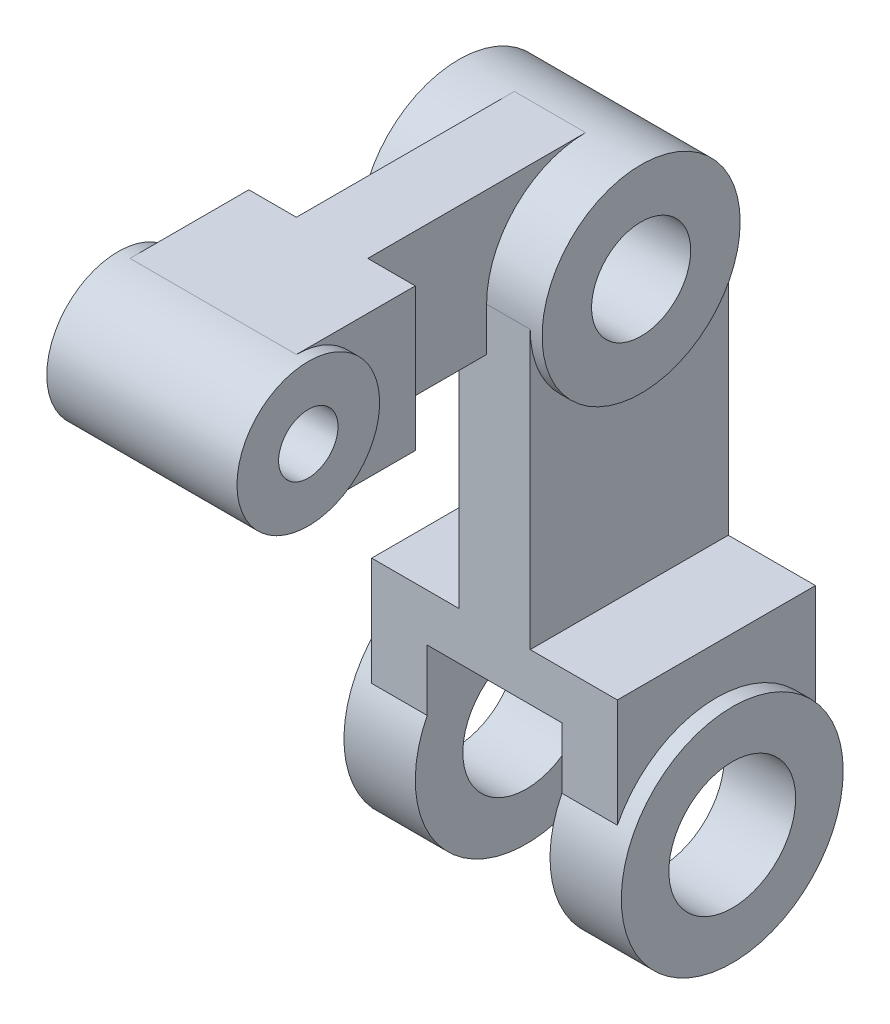
ISO-10303-21;
HEADER;
FILE_DESCRIPTION(('STEP AP214'),'2;1');
FILE_NAME('part.step','',(''),(''),'','','');
FILE_SCHEMA(('AUTOMOTIVE_DESIGN { 1 0 10303 214 1 1 1 1 }'));
ENDSEC;
DATA;
#1=APPLICATION_CONTEXT('core data for automotive mechanical design processes');
#2=APPLICATION_PROTOCOL_DEFINITION('international standard','automotive_design',2000,#1);
#3=PRODUCT_CONTEXT('',#1,'mechanical');
#4=PRODUCT('Part','Part','',(#3));
#5=PRODUCT_RELATED_PRODUCT_CATEGORY('part','',(#4));
#6=PRODUCT_DEFINITION_FORMATION('','',#4);
#7=PRODUCT_DEFINITION_CONTEXT('part definition',#1,'design');
#8=PRODUCT_DEFINITION('design','',#6,#7);
#9=PRODUCT_DEFINITION_SHAPE('','',#8);
#10=(LENGTH_UNIT() NAMED_UNIT(*) SI_UNIT(.MILLI.,.METRE.));
#11=(NAMED_UNIT(*) PLANE_ANGLE_UNIT() SI_UNIT($,.RADIAN.));
#12=(NAMED_UNIT(*) SI_UNIT($,.STERADIAN.) SOLID_ANGLE_UNIT());
#13=UNCERTAINTY_MEASURE_WITH_UNIT(LENGTH_MEASURE(1.E-05),#10,'distance_accuracy_value','');
#14=(GEOMETRIC_REPRESENTATION_CONTEXT(3) GLOBAL_UNCERTAINTY_ASSIGNED_CONTEXT((#13)) GLOBAL_UNIT_ASSIGNED_CONTEXT((#10,
#11,#12)) REPRESENTATION_CONTEXT('',''));
#15=CARTESIAN_POINT('',(0.,0.,0.));
#16=DIRECTION('',(0.,0.,1.));
#17=DIRECTION('',(1.,0.,0.));
#18=AXIS2_PLACEMENT_3D('',#15,#16,#17);
#19=CARTESIAN_POINT('',(31.,40.,25.));
#20=DIRECTION('',(0.,0.,-1.));
#21=DIRECTION('',(0.,1.,0.));
#22=AXIS2_PLACEMENT_3D('',#19,#20,#21);
#23=PLANE('',#22);
#24=DIRECTION('',(1.,0.,0.));
#25=VECTOR('',#24,1.);
#26=CARTESIAN_POINT('',(31.,99.,25.));
#27=LINE('',#26,#25);
#28=CARTESIAN_POINT('',(-9.,99.,25.));
#29=VERTEX_POINT('',#28);
#30=CARTESIAN_POINT('',(-2.,99.,25.));
#31=VERTEX_POINT('',#30);
#32=EDGE_CURVE('E277',#29,#31,#27,.T.);
#33=ORIENTED_EDGE('',*,*,#32,.F.);
#34=DIRECTION('',(0.,1.,0.));
#35=VECTOR('',#34,1.);
#36=CARTESIAN_POINT('',(-9.,0.,25.));
#37=LINE('',#36,#35);
#38=CARTESIAN_POINT('',(-9.,40.,25.));
#39=VERTEX_POINT('',#38);
#40=EDGE_CURVE('E350',#39,#29,#37,.T.);
#41=ORIENTED_EDGE('',*,*,#40,.F.);
#42=DIRECTION('',(-1.,0.,0.));
#43=VECTOR('',#42,1.);
#44=CARTESIAN_POINT('',(31.,40.,25.));
#45=LINE('',#44,#43);
#46=CARTESIAN_POINT('',(-31.,40.,25.));
#47=VERTEX_POINT('',#46);
#48=EDGE_CURVE('E408',#39,#47,#45,.T.);
#49=ORIENTED_EDGE('',*,*,#48,.T.);
#50=DIRECTION('',(0.,-1.,0.));
#51=VECTOR('',#50,1.);
#52=CARTESIAN_POINT('',(-31.,40.,25.));
#53=LINE('',#52,#51);
#54=CARTESIAN_POINT('',(-31.,12.6095202129185,25.));
#55=VERTEX_POINT('',#54);
#56=EDGE_CURVE('E392',#47,#55,#53,.T.);
#57=ORIENTED_EDGE('',*,*,#56,.T.);
#58=DIRECTION('',(-1.,0.,0.));
#59=VECTOR('',#58,1.);
#60=CARTESIAN_POINT('',(31.,12.6095202129185,25.));
#61=LINE('',#60,#59);
#62=CARTESIAN_POINT('',(-17.,12.6095202129185,25.));
#63=VERTEX_POINT('',#62);
#64=EDGE_CURVE('E403',#63,#55,#61,.T.);
#65=ORIENTED_EDGE('',*,*,#64,.F.);
#66=DIRECTION('',(0.,1.,0.));
#67=VECTOR('',#66,1.);
#68=CARTESIAN_POINT('',(-17.,40.,25.));
#69=LINE('',#68,#67);
#70=CARTESIAN_POINT('',(-17.,28.,25.));
#71=VERTEX_POINT('',#70);
#72=EDGE_CURVE('E440',#63,#71,#69,.T.);
#73=ORIENTED_EDGE('',*,*,#72,.T.);
#74=DIRECTION('',(1.,0.,0.));
#75=VECTOR('',#74,1.);
#76=CARTESIAN_POINT('',(31.,28.,25.));
#77=LINE('',#76,#75);
#78=CARTESIAN_POINT('',(17.,28.,25.));
#79=VERTEX_POINT('',#78);
#80=EDGE_CURVE('E436',#71,#79,#77,.T.);
#81=ORIENTED_EDGE('',*,*,#80,.T.);
#82=DIRECTION('',(0.,-1.,0.));
#83=VECTOR('',#82,1.);
#84=CARTESIAN_POINT('',(17.,40.,25.));
#85=LINE('',#84,#83);
#86=CARTESIAN_POINT('',(17.,12.6095202129185,25.));
#87=VERTEX_POINT('',#86);
#88=EDGE_CURVE('E430',#79,#87,#85,.T.);
#89=ORIENTED_EDGE('',*,*,#88,.T.);
#90=CARTESIAN_POINT('',(31.,12.6095202129185,25.));
#91=VERTEX_POINT('',#90);
#92=EDGE_CURVE('E404',#91,#87,#61,.T.);
#93=ORIENTED_EDGE('',*,*,#92,.F.);
#94=DIRECTION('',(0.,-1.,0.));
#95=VECTOR('',#94,1.);
#96=CARTESIAN_POINT('',(31.,40.,25.));
#97=LINE('',#96,#95);
#98=CARTESIAN_POINT('',(31.,40.,25.));
#99=VERTEX_POINT('',#98);
#100=EDGE_CURVE('E376',#99,#91,#97,.T.);
#101=ORIENTED_EDGE('',*,*,#100,.F.);
#102=CARTESIAN_POINT('',(9.,40.,25.));
#103=VERTEX_POINT('',#102);
#104=EDGE_CURVE('E409',#99,#103,#45,.T.);
#105=ORIENTED_EDGE('',*,*,#104,.T.);
#106=DIRECTION('',(0.,1.,0.));
#107=VECTOR('',#106,1.);
#108=CARTESIAN_POINT('',(9.,0.,25.));
#109=LINE('',#108,#107);
#110=CARTESIAN_POINT('',(9.,110.,25.));
#111=VERTEX_POINT('',#110);
#112=EDGE_CURVE('E334',#103,#111,#109,.T.);
#113=ORIENTED_EDGE('',*,*,#112,.T.);
#114=DIRECTION('',(-1.,0.,0.));
#115=VECTOR('',#114,1.);
#116=CARTESIAN_POINT('',(9.,110.,25.));
#117=LINE('',#116,#115);
#118=CARTESIAN_POINT('',(-2.,110.,25.));
#119=VERTEX_POINT('',#118);
#120=EDGE_CURVE('E363',#111,#119,#117,.T.);
#121=ORIENTED_EDGE('',*,*,#120,.T.);
#122=DIRECTION('',(0.,1.,0.));
#123=VECTOR('',#122,1.);
#124=CARTESIAN_POINT('',(-2.,40.,25.));
#125=LINE('',#124,#123);
#126=EDGE_CURVE('E271',#31,#119,#125,.T.);
#127=ORIENTED_EDGE('',*,*,#126,.F.);
#128=EDGE_LOOP('',(#33,#41,#49,#57,#65,#73,#81,#89,#93,#101,#105,#113,#121,#127));
#129=FACE_BOUND('',#128,.T.);
#130=ADVANCED_FACE('F45',(#129),#23,.F.);
#131=CARTESIAN_POINT('',(-9.,0.,0.));
#132=DIRECTION('',(1.,0.,0.));
#133=DIRECTION('',(0.,0.,-1.));
#134=AXIS2_PLACEMENT_3D('',#131,#132,#133);
#135=PLANE('',#134);
#136=DIRECTION('',(0.,0.,1.));
#137=VECTOR('',#136,1.);
#138=CARTESIAN_POINT('',(-9.,99.,0.));
#139=LINE('',#138,#137);
#140=CARTESIAN_POINT('',(-9.,99.,22.4499443206437));
#141=VERTEX_POINT('',#140);
#142=EDGE_CURVE('E274',#141,#29,#139,.T.);
#143=ORIENTED_EDGE('',*,*,#142,.F.);
#144=CARTESIAN_POINT('',(-9.,110.,0.));
#145=DIRECTION('',(1.,0.,0.));
#146=DIRECTION('',(0.,0.,-1.));
#147=AXIS2_PLACEMENT_3D('',#144,#145,#146);
#148=CIRCLE('',#147,25.);
#149=CARTESIAN_POINT('',(-9.,110.,-25.));
#150=VERTEX_POINT('',#149);
#151=EDGE_CURVE('E329',#141,#150,#148,.T.);
#152=ORIENTED_EDGE('',*,*,#151,.T.);
#153=DIRECTION('',(0.,-1.,0.));
#154=VECTOR('',#153,1.);
#155=CARTESIAN_POINT('',(-9.,0.,-25.));
#156=LINE('',#155,#154);
#157=CARTESIAN_POINT('',(-9.,40.,-25.));
#158=VERTEX_POINT('',#157);
#159=EDGE_CURVE('E335',#150,#158,#156,.T.);
#160=ORIENTED_EDGE('',*,*,#159,.T.);
#161=DIRECTION('',(0.,0.,-1.));
#162=VECTOR('',#161,1.);
#163=CARTESIAN_POINT('',(-9.,40.,0.));
#164=LINE('',#163,#162);
#165=EDGE_CURVE('E354',#39,#158,#164,.T.);
#166=ORIENTED_EDGE('',*,*,#165,.F.);
#167=ORIENTED_EDGE('',*,*,#40,.T.);
#168=EDGE_LOOP('',(#143,#152,#160,#166,#167));
#169=FACE_BOUND('',#168,.T.);
#170=ADVANCED_FACE('F464',(#169),#135,.F.);
#171=CARTESIAN_POINT('',(12.,110.,0.));
#172=DIRECTION('',(-1.,0.,0.));
#173=DIRECTION('',(0.,0.,1.));
#174=AXIS2_PLACEMENT_3D('',#171,#172,#173);
#175=CYLINDRICAL_SURFACE('',#174,12.5);
#176=CARTESIAN_POINT('',(12.,110.,0.));
#177=DIRECTION('',(1.,0.,0.));
#178=DIRECTION('',(0.,0.,-1.));
#179=AXIS2_PLACEMENT_3D('',#176,#177,#178);
#180=CIRCLE('',#179,12.5);
#181=CARTESIAN_POINT('',(12.,110.,-12.5));
#182=VERTEX_POINT('',#181);
#183=EDGE_CURVE('E321',#182,#182,#180,.T.);
#184=ORIENTED_EDGE('',*,*,#183,.T.);
#185=EDGE_LOOP('',(#184));
#186=FACE_BOUND('',#185,.T.);
#187=CARTESIAN_POINT('',(-34.,110.,0.));
#188=DIRECTION('',(1.,0.,0.));
#189=DIRECTION('',(0.,0.,-1.));
#190=AXIS2_PLACEMENT_3D('',#187,#188,#189);
#191=CIRCLE('',#190,12.5);
#192=CARTESIAN_POINT('',(-34.,110.,-12.5));
#193=VERTEX_POINT('',#192);
#194=EDGE_CURVE('E313',#193,#193,#191,.T.);
#195=ORIENTED_EDGE('',*,*,#194,.F.);
#196=EDGE_LOOP('',(#195));
#197=FACE_BOUND('',#196,.T.);
#198=ADVANCED_FACE('F522',(#186,#197),#175,.F.);
#199=CARTESIAN_POINT('',(12.,110.,0.));
#200=DIRECTION('',(-1.,0.,0.));
#201=DIRECTION('',(0.,0.,1.));
#202=AXIS2_PLACEMENT_3D('',#199,#200,#201);
#203=CYLINDRICAL_SURFACE('',#202,25.);
#204=CARTESIAN_POINT('',(-34.,110.,0.));
#205=DIRECTION('',(1.,0.,0.));
#206=DIRECTION('',(0.,0.,-1.));
#207=AXIS2_PLACEMENT_3D('',#204,#205,#206);
#208=CIRCLE('',#207,25.);
#209=CARTESIAN_POINT('',(-34.,110.,-25.));
#210=VERTEX_POINT('',#209);
#211=EDGE_CURVE('E317',#210,#210,#208,.T.);
#212=ORIENTED_EDGE('',*,*,#211,.T.);
#213=EDGE_LOOP('',(#212));
#214=FACE_BOUND('',#213,.T.);
#215=CARTESIAN_POINT('',(12.,110.,0.));
#216=DIRECTION('',(1.,0.,0.));
#217=DIRECTION('',(0.,0.,-1.));
#218=AXIS2_PLACEMENT_3D('',#215,#216,#217);
#219=CIRCLE('',#218,25.);
#220=CARTESIAN_POINT('',(12.,110.,-25.));
#221=VERTEX_POINT('',#220);
#222=EDGE_CURVE('E325',#221,#221,#219,.T.);
#223=ORIENTED_EDGE('',*,*,#222,.F.);
#224=EDGE_LOOP('',(#223));
#225=FACE_BOUND('',#224,.T.);
#226=DIRECTION('',(-1.,0.,0.));
#227=VECTOR('',#226,1.);
#228=CARTESIAN_POINT('',(12.,99.,22.4499443206437));
#229=LINE('',#228,#227);
#230=CARTESIAN_POINT('',(-20.,99.,22.4499443206437));
#231=VERTEX_POINT('',#230);
#232=EDGE_CURVE('E11',#231,#141,#229,.F.);
#233=ORIENTED_EDGE('',*,*,#232,.F.);
#234=CARTESIAN_POINT('',(-20.,110.,0.));
#235=DIRECTION('',(1.,0.,0.));
#236=DIRECTION('',(0.,0.,-1.));
#237=AXIS2_PLACEMENT_3D('',#234,#235,#236);
#238=CIRCLE('',#237,25.);
#239=CARTESIAN_POINT('',(-20.,135.,0.));
#240=VERTEX_POINT('',#239);
#241=EDGE_CURVE('E55',#240,#231,#238,.T.);
#242=ORIENTED_EDGE('',*,*,#241,.F.);
#243=DIRECTION('',(-1.,0.,0.));
#244=VECTOR('',#243,1.);
#245=CARTESIAN_POINT('',(-20.,135.,0.));
#246=LINE('',#245,#244);
#247=CARTESIAN_POINT('',(-2.,135.,0.));
#248=VERTEX_POINT('',#247);
#249=EDGE_CURVE('E246',#248,#240,#246,.T.);
#250=ORIENTED_EDGE('',*,*,#249,.F.);
#251=CARTESIAN_POINT('',(-2.,110.,0.));
#252=DIRECTION('',(-1.,0.,0.));
#253=DIRECTION('',(0.,0.,1.));
#254=AXIS2_PLACEMENT_3D('',#251,#252,#253);
#255=CIRCLE('',#254,25.);
#256=EDGE_CURVE('E444',#119,#248,#255,.T.);
#257=ORIENTED_EDGE('',*,*,#256,.F.);
#258=ORIENTED_EDGE('',*,*,#120,.F.);
#259=CARTESIAN_POINT('',(9.,110.,0.));
#260=DIRECTION('',(1.,0.,0.));
#261=DIRECTION('',(0.,0.,-1.));
#262=AXIS2_PLACEMENT_3D('',#259,#260,#261);
#263=CIRCLE('',#262,25.);
#264=CARTESIAN_POINT('',(9.,110.,-25.));
#265=VERTEX_POINT('',#264);
#266=EDGE_CURVE('E330',#111,#265,#263,.T.);
#267=ORIENTED_EDGE('',*,*,#266,.T.);
#268=DIRECTION('',(-1.,0.,0.));
#269=VECTOR('',#268,1.);
#270=CARTESIAN_POINT('',(9.,110.,-25.));
#271=LINE('',#270,#269);
#272=EDGE_CURVE('E347',#265,#150,#271,.T.);
#273=ORIENTED_EDGE('',*,*,#272,.T.);
#274=ORIENTED_EDGE('',*,*,#151,.F.);
#275=EDGE_LOOP('',(#233,#242,#250,#257,#258,#267,#273,#274));
#276=FACE_BOUND('',#275,.T.);
#277=ADVANCED_FACE('F460',(#214,#225,#276),#203,.T.);
#278=CARTESIAN_POINT('',(35.,0.,0.));
#279=DIRECTION('',(-1.,0.,0.));
#280=DIRECTION('',(0.,0.,1.));
#281=AXIS2_PLACEMENT_3D('',#278,#279,#280);
#282=CYLINDRICAL_SURFACE('',#281,28.);
#283=CARTESIAN_POINT('',(35.,0.,0.));
#284=DIRECTION('',(1.,0.,0.));
#285=DIRECTION('',(0.,0.,-1.));
#286=AXIS2_PLACEMENT_3D('',#283,#284,#285);
#287=CIRCLE('',#286,28.);
#288=CARTESIAN_POINT('',(35.,0.,-28.));
#289=VERTEX_POINT('',#288);
#290=EDGE_CURVE('E426',#289,#289,#287,.T.);
#291=ORIENTED_EDGE('',*,*,#290,.F.);
#292=EDGE_LOOP('',(#291));
#293=FACE_BOUND('',#292,.T.);
#294=ORIENTED_EDGE('',*,*,#92,.T.);
#295=CARTESIAN_POINT('',(17.,0.,0.));
#296=DIRECTION('',(1.,0.,0.));
#297=DIRECTION('',(0.,1.,0.));
#298=AXIS2_PLACEMENT_3D('',#295,#296,#297);
#299=CIRCLE('',#298,28.);
#300=CARTESIAN_POINT('',(17.,12.6095202129185,-25.));
#301=VERTEX_POINT('',#300);
#302=EDGE_CURVE('E70',#87,#301,#299,.T.);
#303=ORIENTED_EDGE('',*,*,#302,.T.);
#304=DIRECTION('',(-1.,0.,0.));
#305=VECTOR('',#304,1.);
#306=CARTESIAN_POINT('',(31.,12.6095202129185,-25.));
#307=LINE('',#306,#305);
#308=CARTESIAN_POINT('',(31.,12.6095202129185,-25.));
#309=VERTEX_POINT('',#308);
#310=EDGE_CURVE('E399',#309,#301,#307,.T.);
#311=ORIENTED_EDGE('',*,*,#310,.F.);
#312=CARTESIAN_POINT('',(31.,0.,0.));
#313=DIRECTION('',(-1.,0.,0.));
#314=DIRECTION('',(0.,0.,-1.));
#315=AXIS2_PLACEMENT_3D('',#312,#313,#314);
#316=CIRCLE('',#315,28.);
#317=EDGE_CURVE('E380',#91,#309,#316,.T.);
#318=ORIENTED_EDGE('',*,*,#317,.F.);
#319=EDGE_LOOP('',(#294,#303,#311,#318));
#320=FACE_BOUND('',#319,.T.);
#321=ADVANCED_FACE('F553',(#293,#320),#282,.T.);
#322=CARTESIAN_POINT('',(35.,0.,0.));
#323=DIRECTION('',(-1.,0.,0.));
#324=DIRECTION('',(0.,0.,1.));
#325=AXIS2_PLACEMENT_3D('',#322,#323,#324);
#326=CYLINDRICAL_SURFACE('',#325,16.);
#327=CARTESIAN_POINT('',(-17.,0.,0.));
#328=DIRECTION('',(-1.,0.,0.));
#329=DIRECTION('',(0.,-1.,0.));
#330=AXIS2_PLACEMENT_3D('',#327,#328,#329);
#331=CIRCLE('',#330,16.);
#332=CARTESIAN_POINT('',(-17.,-16.,0.));
#333=VERTEX_POINT('',#332);
#334=EDGE_CURVE('E309',#333,#333,#331,.T.);
#335=ORIENTED_EDGE('',*,*,#334,.F.);
#336=EDGE_LOOP('',(#335));
#337=FACE_BOUND('',#336,.T.);
#338=CARTESIAN_POINT('',(-35.,0.,0.));
#339=DIRECTION('',(1.,0.,0.));
#340=DIRECTION('',(0.,0.,-1.));
#341=AXIS2_PLACEMENT_3D('',#338,#339,#340);
#342=CIRCLE('',#341,16.);
#343=CARTESIAN_POINT('',(-35.,0.,-16.));
#344=VERTEX_POINT('',#343);
#345=EDGE_CURVE('E417',#344,#344,#342,.T.);
#346=ORIENTED_EDGE('',*,*,#345,.F.);
#347=EDGE_LOOP('',(#346));
#348=FACE_BOUND('',#347,.T.);
#349=ADVANCED_FACE('F542',(#337,#348),#326,.F.);
#350=CARTESIAN_POINT('',(31.,40.,25.));
#351=DIRECTION('',(0.,-1.,0.));
#352=DIRECTION('',(0.,0.,-1.));
#353=AXIS2_PLACEMENT_3D('',#350,#351,#352);
#354=PLANE('',#353);
#355=DIRECTION('',(0.,0.,-1.));
#356=VECTOR('',#355,1.);
#357=CARTESIAN_POINT('',(9.,40.,0.));
#358=LINE('',#357,#356);
#359=CARTESIAN_POINT('',(9.,40.,-25.));
#360=VERTEX_POINT('',#359);
#361=EDGE_CURVE('E339',#103,#360,#358,.T.);
#362=ORIENTED_EDGE('',*,*,#361,.F.);
#363=ORIENTED_EDGE('',*,*,#104,.F.);
#364=DIRECTION('',(0.,0.,1.));
#365=VECTOR('',#364,1.);
#366=CARTESIAN_POINT('',(31.,40.,25.));
#367=LINE('',#366,#365);
#368=CARTESIAN_POINT('',(31.,40.,-25.));
#369=VERTEX_POINT('',#368);
#370=EDGE_CURVE('E372',#369,#99,#367,.T.);
#371=ORIENTED_EDGE('',*,*,#370,.F.);
#372=DIRECTION('',(-1.,0.,0.));
#373=VECTOR('',#372,1.);
#374=CARTESIAN_POINT('',(31.,40.,-25.));
#375=LINE('',#374,#373);
#376=EDGE_CURVE('E414',#369,#360,#375,.T.);
#377=ORIENTED_EDGE('',*,*,#376,.T.);
#378=EDGE_LOOP('',(#362,#363,#371,#377));
#379=FACE_BOUND('',#378,.T.);
#380=ADVANCED_FACE('F534',(#379),#354,.F.);
#381=CARTESIAN_POINT('',(35.,0.,0.));
#382=DIRECTION('',(1.,0.,0.));
#383=DIRECTION('',(0.,0.,-1.));
#384=AXIS2_PLACEMENT_3D('',#381,#382,#383);
#385=PLANE('',#384);
#386=ORIENTED_EDGE('',*,*,#290,.T.);
#387=EDGE_LOOP('',(#386));
#388=FACE_BOUND('',#387,.T.);
#389=CARTESIAN_POINT('',(35.,0.,0.));
#390=DIRECTION('',(1.,0.,0.));
#391=DIRECTION('',(0.,0.,-1.));
#392=AXIS2_PLACEMENT_3D('',#389,#390,#391);
#393=CIRCLE('',#392,16.);
#394=CARTESIAN_POINT('',(35.,0.,-16.));
#395=VERTEX_POINT('',#394);
#396=EDGE_CURVE('E418',#395,#395,#393,.T.);
#397=ORIENTED_EDGE('',*,*,#396,.F.);
#398=EDGE_LOOP('',(#397));
#399=FACE_BOUND('',#398,.T.);
#400=ADVANCED_FACE('F543',(#388,#399),#385,.T.);
#401=CARTESIAN_POINT('',(-35.,0.,0.));
#402=DIRECTION('',(1.,0.,0.));
#403=DIRECTION('',(0.,0.,-1.));
#404=AXIS2_PLACEMENT_3D('',#401,#402,#403);
#405=PLANE('',#404);
#406=CARTESIAN_POINT('',(-35.,0.,0.));
#407=DIRECTION('',(1.,0.,0.));
#408=DIRECTION('',(0.,0.,-1.));
#409=AXIS2_PLACEMENT_3D('',#406,#407,#408);
#410=CIRCLE('',#409,28.);
#411=CARTESIAN_POINT('',(-35.,0.,-28.));
#412=VERTEX_POINT('',#411);
#413=EDGE_CURVE('E422',#412,#412,#410,.T.);
#414=ORIENTED_EDGE('',*,*,#413,.F.);
#415=EDGE_LOOP('',(#414));
#416=FACE_BOUND('',#415,.T.);
#417=ORIENTED_EDGE('',*,*,#345,.T.);
#418=EDGE_LOOP('',(#417));
#419=FACE_BOUND('',#418,.T.);
#420=ADVANCED_FACE('F545',(#416,#419),#405,.F.);
#421=CARTESIAN_POINT('',(-17.,0.,0.));
#422=DIRECTION('',(-1.,0.,0.));
#423=DIRECTION('',(0.,-1.,0.));
#424=AXIS2_PLACEMENT_3D('',#421,#422,#423);
#425=CIRCLE('',#424,28.);
#426=CARTESIAN_POINT('',(-17.,12.6095202129185,-25.));
#427=VERTEX_POINT('',#426);
#428=EDGE_CURVE('E302',#427,#63,#425,.T.);
#429=ORIENTED_EDGE('',*,*,#428,.T.);
#430=ORIENTED_EDGE('',*,*,#64,.T.);
#431=CARTESIAN_POINT('',(-31.,0.,0.));
#432=DIRECTION('',(-1.,0.,0.));
#433=DIRECTION('',(0.,0.,-1.));
#434=AXIS2_PLACEMENT_3D('',#431,#432,#433);
#435=CIRCLE('',#434,28.);
#436=CARTESIAN_POINT('',(-31.,12.6095202129185,-25.));
#437=VERTEX_POINT('',#436);
#438=EDGE_CURVE('E373',#55,#437,#435,.T.);
#439=ORIENTED_EDGE('',*,*,#438,.T.);
#440=EDGE_CURVE('E384',#427,#437,#307,.T.);
#441=ORIENTED_EDGE('',*,*,#440,.F.);
#442=EDGE_LOOP('',(#429,#430,#439,#441));
#443=FACE_BOUND('',#442,.T.);
#444=ORIENTED_EDGE('',*,*,#413,.T.);
#445=EDGE_LOOP('',(#444));
#446=FACE_BOUND('',#445,.T.);
#447=ADVANCED_FACE('F47',(#443,#446),#282,.T.);
#448=CARTESIAN_POINT('',(17.,0.,0.));
#449=DIRECTION('',(1.,0.,0.));
#450=DIRECTION('',(0.,1.,0.));
#451=AXIS2_PLACEMENT_3D('',#448,#449,#450);
#452=CIRCLE('',#451,16.);
#453=CARTESIAN_POINT('',(17.,16.,0.));
#454=VERTEX_POINT('',#453);
#455=EDGE_CURVE('E294',#454,#454,#452,.T.);
#456=ORIENTED_EDGE('',*,*,#455,.F.);
#457=EDGE_LOOP('',(#456));
#458=FACE_BOUND('',#457,.T.);
#459=ORIENTED_EDGE('',*,*,#396,.T.);
#460=EDGE_LOOP('',(#459));
#461=FACE_BOUND('',#460,.T.);
#462=ADVANCED_FACE('F537',(#458,#461),#326,.F.);
#463=CARTESIAN_POINT('',(31.,40.,-25.));
#464=DIRECTION('',(0.,0.,1.));
#465=DIRECTION('',(0.,-1.,0.));
#466=AXIS2_PLACEMENT_3D('',#463,#464,#465);
#467=PLANE('',#466);
#468=DIRECTION('',(-1.,0.,0.));
#469=VECTOR('',#468,1.);
#470=CARTESIAN_POINT('',(31.,28.,-25.));
#471=LINE('',#470,#469);
#472=CARTESIAN_POINT('',(17.,28.,-25.));
#473=VERTEX_POINT('',#472);
#474=CARTESIAN_POINT('',(-17.,28.,-25.));
#475=VERTEX_POINT('',#474);
#476=EDGE_CURVE('E298',#473,#475,#471,.T.);
#477=ORIENTED_EDGE('',*,*,#476,.T.);
#478=DIRECTION('',(0.,-1.,0.));
#479=VECTOR('',#478,1.);
#480=CARTESIAN_POINT('',(-17.,40.,-25.));
#481=LINE('',#480,#479);
#482=EDGE_CURVE('E305',#475,#427,#481,.T.);
#483=ORIENTED_EDGE('',*,*,#482,.T.);
#484=ORIENTED_EDGE('',*,*,#440,.T.);
#485=DIRECTION('',(0.,1.,0.));
#486=VECTOR('',#485,1.);
#487=CARTESIAN_POINT('',(-31.,40.,-25.));
#488=LINE('',#487,#486);
#489=CARTESIAN_POINT('',(-31.,40.,-25.));
#490=VERTEX_POINT('',#489);
#491=EDGE_CURVE('E367',#437,#490,#488,.T.);
#492=ORIENTED_EDGE('',*,*,#491,.T.);
#493=EDGE_CURVE('E413',#158,#490,#375,.T.);
#494=ORIENTED_EDGE('',*,*,#493,.F.);
#495=ORIENTED_EDGE('',*,*,#159,.F.);
#496=ORIENTED_EDGE('',*,*,#272,.F.);
#497=DIRECTION('',(0.,-1.,0.));
#498=VECTOR('',#497,1.);
#499=CARTESIAN_POINT('',(9.,0.,-25.));
#500=LINE('',#499,#498);
#501=EDGE_CURVE('E343',#265,#360,#500,.T.);
#502=ORIENTED_EDGE('',*,*,#501,.T.);
#503=ORIENTED_EDGE('',*,*,#376,.F.);
#504=DIRECTION('',(0.,1.,0.));
#505=VECTOR('',#504,1.);
#506=CARTESIAN_POINT('',(31.,40.,-25.));
#507=LINE('',#506,#505);
#508=EDGE_CURVE('E368',#309,#369,#507,.T.);
#509=ORIENTED_EDGE('',*,*,#508,.F.);
#510=ORIENTED_EDGE('',*,*,#310,.T.);
#511=DIRECTION('',(0.,1.,0.));
#512=VECTOR('',#511,1.);
#513=CARTESIAN_POINT('',(17.,40.,-25.));
#514=LINE('',#513,#512);
#515=EDGE_CURVE('E290',#301,#473,#514,.T.);
#516=ORIENTED_EDGE('',*,*,#515,.T.);
#517=EDGE_LOOP('',(#477,#483,#484,#492,#494,#495,#496,#502,#503,#509,#510,#516));
#518=FACE_BOUND('',#517,.T.);
#519=ADVANCED_FACE('F532',(#518),#467,.F.);
#520=ORIENTED_EDGE('',*,*,#48,.F.);
#521=ORIENTED_EDGE('',*,*,#165,.T.);
#522=ORIENTED_EDGE('',*,*,#493,.T.);
#523=DIRECTION('',(0.,0.,1.));
#524=VECTOR('',#523,1.);
#525=CARTESIAN_POINT('',(-31.,40.,25.));
#526=LINE('',#525,#524);
#527=EDGE_CURVE('E388',#490,#47,#526,.T.);
#528=ORIENTED_EDGE('',*,*,#527,.T.);
#529=EDGE_LOOP('',(#520,#521,#522,#528));
#530=FACE_BOUND('',#529,.T.);
#531=ADVANCED_FACE('F528',(#530),#354,.F.);
#532=CARTESIAN_POINT('',(31.,0.,0.));
#533=DIRECTION('',(1.,0.,0.));
#534=DIRECTION('',(0.,0.,-1.));
#535=AXIS2_PLACEMENT_3D('',#532,#533,#534);
#536=PLANE('',#535);
#537=ORIENTED_EDGE('',*,*,#508,.T.);
#538=ORIENTED_EDGE('',*,*,#370,.T.);
#539=ORIENTED_EDGE('',*,*,#100,.T.);
#540=ORIENTED_EDGE('',*,*,#317,.T.);
#541=EDGE_LOOP('',(#537,#538,#539,#540));
#542=FACE_BOUND('',#541,.T.);
#543=ADVANCED_FACE('F531',(#542),#536,.T.);
#544=CARTESIAN_POINT('',(-31.,0.,0.));
#545=DIRECTION('',(1.,0.,0.));
#546=DIRECTION('',(0.,0.,-1.));
#547=AXIS2_PLACEMENT_3D('',#544,#545,#546);
#548=PLANE('',#547);
#549=ORIENTED_EDGE('',*,*,#491,.F.);
#550=ORIENTED_EDGE('',*,*,#438,.F.);
#551=ORIENTED_EDGE('',*,*,#56,.F.);
#552=ORIENTED_EDGE('',*,*,#527,.F.);
#553=EDGE_LOOP('',(#549,#550,#551,#552));
#554=FACE_BOUND('',#553,.T.);
#555=ADVANCED_FACE('F526',(#554),#548,.F.);
#556=CARTESIAN_POINT('',(9.,0.,0.));
#557=DIRECTION('',(1.,0.,0.));
#558=DIRECTION('',(0.,0.,-1.));
#559=AXIS2_PLACEMENT_3D('',#556,#557,#558);
#560=PLANE('',#559);
#561=ORIENTED_EDGE('',*,*,#266,.F.);
#562=ORIENTED_EDGE('',*,*,#112,.F.);
#563=ORIENTED_EDGE('',*,*,#361,.T.);
#564=ORIENTED_EDGE('',*,*,#501,.F.);
#565=EDGE_LOOP('',(#561,#562,#563,#564));
#566=FACE_BOUND('',#565,.T.);
#567=ADVANCED_FACE('F593',(#566),#560,.T.);
#568=CARTESIAN_POINT('',(12.,0.,0.));
#569=DIRECTION('',(1.,0.,0.));
#570=DIRECTION('',(0.,0.,-1.));
#571=AXIS2_PLACEMENT_3D('',#568,#569,#570);
#572=PLANE('',#571);
#573=ORIENTED_EDGE('',*,*,#183,.F.);
#574=EDGE_LOOP('',(#573));
#575=FACE_BOUND('',#574,.T.);
#576=ORIENTED_EDGE('',*,*,#222,.T.);
#577=EDGE_LOOP('',(#576));
#578=FACE_BOUND('',#577,.T.);
#579=ADVANCED_FACE('F614',(#575,#578),#572,.T.);
#580=CARTESIAN_POINT('',(-34.,0.,0.));
#581=DIRECTION('',(1.,0.,0.));
#582=DIRECTION('',(0.,0.,-1.));
#583=AXIS2_PLACEMENT_3D('',#580,#581,#582);
#584=PLANE('',#583);
#585=ORIENTED_EDGE('',*,*,#194,.T.);
#586=EDGE_LOOP('',(#585));
#587=FACE_BOUND('',#586,.T.);
#588=ORIENTED_EDGE('',*,*,#211,.F.);
#589=EDGE_LOOP('',(#588));
#590=FACE_BOUND('',#589,.T.);
#591=ADVANCED_FACE('F572',(#587,#590),#584,.F.);
#592=CARTESIAN_POINT('',(-17.,28.,-28.));
#593=DIRECTION('',(-1.,0.,0.));
#594=DIRECTION('',(0.,-1.,0.));
#595=AXIS2_PLACEMENT_3D('',#592,#593,#594);
#596=PLANE('',#595);
#597=ORIENTED_EDGE('',*,*,#334,.T.);
#598=EDGE_LOOP('',(#597));
#599=FACE_BOUND('',#598,.T.);
#600=DIRECTION('',(0.,0.,1.));
#601=VECTOR('',#600,1.);
#602=CARTESIAN_POINT('',(-17.,28.,-28.));
#603=LINE('',#602,#601);
#604=EDGE_CURVE('E281',#475,#71,#603,.T.);
#605=ORIENTED_EDGE('',*,*,#604,.T.);
#606=ORIENTED_EDGE('',*,*,#72,.F.);
#607=ORIENTED_EDGE('',*,*,#428,.F.);
#608=ORIENTED_EDGE('',*,*,#482,.F.);
#609=EDGE_LOOP('',(#605,#606,#607,#608));
#610=FACE_BOUND('',#609,.T.);
#611=ADVANCED_FACE('F568',(#599,#610),#596,.F.);
#612=CARTESIAN_POINT('',(-17.,28.,-28.));
#613=DIRECTION('',(0.,1.,0.));
#614=DIRECTION('',(0.,0.,1.));
#615=AXIS2_PLACEMENT_3D('',#612,#613,#614);
#616=PLANE('',#615);
#617=DIRECTION('',(0.,0.,1.));
#618=VECTOR('',#617,1.);
#619=CARTESIAN_POINT('',(17.,28.,-28.));
#620=LINE('',#619,#618);
#621=EDGE_CURVE('E280',#473,#79,#620,.T.);
#622=ORIENTED_EDGE('',*,*,#621,.T.);
#623=ORIENTED_EDGE('',*,*,#80,.F.);
#624=ORIENTED_EDGE('',*,*,#604,.F.);
#625=ORIENTED_EDGE('',*,*,#476,.F.);
#626=EDGE_LOOP('',(#622,#623,#624,#625));
#627=FACE_BOUND('',#626,.T.);
#628=ADVANCED_FACE('F571',(#627),#616,.F.);
#629=CARTESIAN_POINT('',(17.,28.,-28.));
#630=DIRECTION('',(1.,0.,0.));
#631=DIRECTION('',(0.,1.,0.));
#632=AXIS2_PLACEMENT_3D('',#629,#630,#631);
#633=PLANE('',#632);
#634=ORIENTED_EDGE('',*,*,#455,.T.);
#635=EDGE_LOOP('',(#634));
#636=FACE_BOUND('',#635,.T.);
#637=ORIENTED_EDGE('',*,*,#302,.F.);
#638=ORIENTED_EDGE('',*,*,#88,.F.);
#639=ORIENTED_EDGE('',*,*,#621,.F.);
#640=ORIENTED_EDGE('',*,*,#515,.F.);
#641=EDGE_LOOP('',(#637,#638,#639,#640));
#642=FACE_BOUND('',#641,.T.);
#643=ADVANCED_FACE('F601',(#636,#642),#633,.F.);
#644=CARTESIAN_POINT('',(-20.,135.,55.));
#645=DIRECTION('',(0.,-1.,0.));
#646=DIRECTION('',(0.,0.,-1.));
#647=AXIS2_PLACEMENT_3D('',#644,#645,#646);
#648=PLANE('',#647);
#649=ORIENTED_EDGE('',*,*,#249,.T.);
#650=DIRECTION('',(0.,0.,-1.));
#651=VECTOR('',#650,1.);
#652=CARTESIAN_POINT('',(-20.,135.,55.));
#653=LINE('',#652,#651);
#654=CARTESIAN_POINT('',(-20.,135.,55.));
#655=VERTEX_POINT('',#654);
#656=EDGE_CURVE('E255',#655,#240,#653,.T.);
#657=ORIENTED_EDGE('',*,*,#656,.F.);
#658=DIRECTION('',(-1.,0.,0.));
#659=VECTOR('',#658,1.);
#660=CARTESIAN_POINT('',(-32.,135.,55.));
#661=LINE('',#660,#659);
#662=CARTESIAN_POINT('',(-32.,135.,55.));
#663=VERTEX_POINT('',#662);
#664=EDGE_CURVE('E195',#655,#663,#661,.T.);
#665=ORIENTED_EDGE('',*,*,#664,.T.);
#666=DIRECTION('',(0.,0.,-1.));
#667=VECTOR('',#666,1.);
#668=CARTESIAN_POINT('',(-32.,135.,85.));
#669=LINE('',#668,#667);
#670=CARTESIAN_POINT('',(-32.,135.,85.));
#671=VERTEX_POINT('',#670);
#672=EDGE_CURVE('E187',#671,#663,#669,.T.);
#673=ORIENTED_EDGE('',*,*,#672,.F.);
#674=DIRECTION('',(-1.,0.,0.));
#675=VECTOR('',#674,1.);
#676=CARTESIAN_POINT('',(-32.,135.,85.));
#677=LINE('',#676,#675);
#678=CARTESIAN_POINT('',(10.,135.,85.));
#679=VERTEX_POINT('',#678);
#680=EDGE_CURVE('E192',#679,#671,#677,.T.);
#681=ORIENTED_EDGE('',*,*,#680,.F.);
#682=DIRECTION('',(0.,0.,-1.));
#683=VECTOR('',#682,1.);
#684=CARTESIAN_POINT('',(10.,135.,85.));
#685=LINE('',#684,#683);
#686=CARTESIAN_POINT('',(10.,135.,55.));
#687=VERTEX_POINT('',#686);
#688=EDGE_CURVE('E199',#679,#687,#685,.T.);
#689=ORIENTED_EDGE('',*,*,#688,.T.);
#690=CARTESIAN_POINT('',(-2.00000000000001,135.,55.));
#691=VERTEX_POINT('',#690);
#692=EDGE_CURVE('E233',#687,#691,#661,.T.);
#693=ORIENTED_EDGE('',*,*,#692,.T.);
#694=DIRECTION('',(0.,0.,-1.));
#695=VECTOR('',#694,1.);
#696=CARTESIAN_POINT('',(-2.,135.,55.));
#697=LINE('',#696,#695);
#698=EDGE_CURVE('E62',#691,#248,#697,.T.);
#699=ORIENTED_EDGE('',*,*,#698,.T.);
#700=EDGE_LOOP('',(#649,#657,#665,#673,#681,#689,#693,#699));
#701=FACE_BOUND('',#700,.T.);
#702=ADVANCED_FACE('F189',(#701),#648,.F.);
#703=CARTESIAN_POINT('',(-2.,99.,55.));
#704=DIRECTION('',(-1.,0.,0.));
#705=DIRECTION('',(0.,0.,1.));
#706=AXIS2_PLACEMENT_3D('',#703,#704,#705);
#707=PLANE('',#706);
#708=DIRECTION('',(0.,0.,-1.));
#709=VECTOR('',#708,1.);
#710=CARTESIAN_POINT('',(-2.,99.,55.));
#711=LINE('',#710,#709);
#712=CARTESIAN_POINT('',(-2.,99.,55.));
#713=VERTEX_POINT('',#712);
#714=EDGE_CURVE('E263',#713,#31,#711,.T.);
#715=ORIENTED_EDGE('',*,*,#714,.T.);
#716=ORIENTED_EDGE('',*,*,#126,.T.);
#717=ORIENTED_EDGE('',*,*,#256,.T.);
#718=ORIENTED_EDGE('',*,*,#698,.F.);
#719=DIRECTION('',(0.,1.,0.));
#720=VECTOR('',#719,1.);
#721=CARTESIAN_POINT('',(-2.,99.,55.));
#722=LINE('',#721,#720);
#723=EDGE_CURVE('E251',#713,#691,#722,.T.);
#724=ORIENTED_EDGE('',*,*,#723,.F.);
#725=EDGE_LOOP('',(#715,#716,#717,#718,#724));
#726=FACE_BOUND('',#725,.T.);
#727=ADVANCED_FACE('F473',(#726),#707,.F.);
#728=CARTESIAN_POINT('',(-20.,99.,55.));
#729=DIRECTION('',(1.,0.,0.));
#730=DIRECTION('',(0.,0.,-1.));
#731=AXIS2_PLACEMENT_3D('',#728,#729,#730);
#732=PLANE('',#731);
#733=ORIENTED_EDGE('',*,*,#656,.T.);
#734=ORIENTED_EDGE('',*,*,#241,.T.);
#735=DIRECTION('',(0.,0.,-1.));
#736=VECTOR('',#735,1.);
#737=CARTESIAN_POINT('',(-20.,99.,55.));
#738=LINE('',#737,#736);
#739=CARTESIAN_POINT('',(-20.,99.,55.));
#740=VERTEX_POINT('',#739);
#741=EDGE_CURVE('E267',#740,#231,#738,.T.);
#742=ORIENTED_EDGE('',*,*,#741,.F.);
#743=DIRECTION('',(0.,-1.,0.));
#744=VECTOR('',#743,1.);
#745=CARTESIAN_POINT('',(-20.,99.,55.));
#746=LINE('',#745,#744);
#747=EDGE_CURVE('E247',#655,#740,#746,.T.);
#748=ORIENTED_EDGE('',*,*,#747,.F.);
#749=EDGE_LOOP('',(#733,#734,#742,#748));
#750=FACE_BOUND('',#749,.T.);
#751=ADVANCED_FACE('F450',(#750),#732,.F.);
#752=CARTESIAN_POINT('',(-20.,99.,55.));
#753=DIRECTION('',(0.,1.,0.));
#754=DIRECTION('',(0.,0.,1.));
#755=AXIS2_PLACEMENT_3D('',#752,#753,#754);
#756=PLANE('',#755);
#757=ORIENTED_EDGE('',*,*,#142,.T.);
#758=ORIENTED_EDGE('',*,*,#32,.T.);
#759=ORIENTED_EDGE('',*,*,#714,.F.);
#760=DIRECTION('',(1.,0.,0.));
#761=VECTOR('',#760,1.);
#762=CARTESIAN_POINT('',(-32.,99.,55.));
#763=LINE('',#762,#761);
#764=CARTESIAN_POINT('',(10.,99.,55.));
#765=VERTEX_POINT('',#764);
#766=EDGE_CURVE('E225',#713,#765,#763,.T.);
#767=ORIENTED_EDGE('',*,*,#766,.T.);
#768=DIRECTION('',(0.,0.,-1.));
#769=VECTOR('',#768,1.);
#770=CARTESIAN_POINT('',(10.,99.,85.));
#771=LINE('',#770,#769);
#772=CARTESIAN_POINT('',(10.,99.,85.));
#773=VERTEX_POINT('',#772);
#774=EDGE_CURVE('E222',#773,#765,#771,.T.);
#775=ORIENTED_EDGE('',*,*,#774,.F.);
#776=DIRECTION('',(1.,0.,0.));
#777=VECTOR('',#776,1.);
#778=CARTESIAN_POINT('',(-32.,99.,85.));
#779=LINE('',#778,#777);
#780=CARTESIAN_POINT('',(-32.,99.,85.));
#781=VERTEX_POINT('',#780);
#782=EDGE_CURVE('E217',#781,#773,#779,.T.);
#783=ORIENTED_EDGE('',*,*,#782,.F.);
#784=DIRECTION('',(0.,0.,-1.));
#785=VECTOR('',#784,1.);
#786=CARTESIAN_POINT('',(-32.,99.,85.));
#787=LINE('',#786,#785);
#788=CARTESIAN_POINT('',(-32.,99.,55.));
#789=VERTEX_POINT('',#788);
#790=EDGE_CURVE('E200',#781,#789,#787,.T.);
#791=ORIENTED_EDGE('',*,*,#790,.T.);
#792=EDGE_CURVE('E218',#789,#740,#763,.T.);
#793=ORIENTED_EDGE('',*,*,#792,.T.);
#794=ORIENTED_EDGE('',*,*,#741,.T.);
#795=ORIENTED_EDGE('',*,*,#232,.T.);
#796=EDGE_LOOP('',(#757,#758,#759,#767,#775,#783,#791,#793,#794,#795));
#797=FACE_BOUND('',#796,.T.);
#798=ADVANCED_FACE('F456',(#797),#756,.F.);
#799=CARTESIAN_POINT('',(0.,0.,55.));
#800=DIRECTION('',(0.,0.,-1.));
#801=DIRECTION('',(-1.,0.,0.));
#802=AXIS2_PLACEMENT_3D('',#799,#800,#801);
#803=PLANE('',#802);
#804=ORIENTED_EDGE('',*,*,#664,.F.);
#805=ORIENTED_EDGE('',*,*,#747,.T.);
#806=ORIENTED_EDGE('',*,*,#792,.F.);
#807=DIRECTION('',(0.,-1.,0.));
#808=VECTOR('',#807,1.);
#809=CARTESIAN_POINT('',(-32.,99.,55.));
#810=LINE('',#809,#808);
#811=EDGE_CURVE('E236',#663,#789,#810,.T.);
#812=ORIENTED_EDGE('',*,*,#811,.F.);
#813=EDGE_LOOP('',(#804,#805,#806,#812));
#814=FACE_BOUND('',#813,.T.);
#815=ADVANCED_FACE('F476',(#814),#803,.T.);
#816=CARTESIAN_POINT('',(10.,99.,85.));
#817=DIRECTION('',(-1.,0.,0.));
#818=DIRECTION('',(0.,0.,1.));
#819=AXIS2_PLACEMENT_3D('',#816,#817,#818);
#820=PLANE('',#819);
#821=CARTESIAN_POINT('',(10.,117.,85.));
#822=DIRECTION('',(-1.,0.,0.));
#823=DIRECTION('',(0.,0.,1.));
#824=AXIS2_PLACEMENT_3D('',#821,#822,#823);
#825=CIRCLE('',#824,18.);
#826=EDGE_CURVE('E210',#773,#679,#825,.F.);
#827=ORIENTED_EDGE('',*,*,#826,.F.);
#828=ORIENTED_EDGE('',*,*,#774,.T.);
#829=DIRECTION('',(0.,1.,0.));
#830=VECTOR('',#829,1.);
#831=CARTESIAN_POINT('',(10.,99.,55.));
#832=LINE('',#831,#830);
#833=EDGE_CURVE('E229',#765,#687,#832,.T.);
#834=ORIENTED_EDGE('',*,*,#833,.T.);
#835=ORIENTED_EDGE('',*,*,#688,.F.);
#836=EDGE_LOOP('',(#827,#828,#834,#835));
#837=FACE_BOUND('',#836,.T.);
#838=ADVANCED_FACE('F723',(#837),#820,.F.);
#839=CARTESIAN_POINT('',(-32.,99.,85.));
#840=DIRECTION('',(1.,0.,0.));
#841=DIRECTION('',(0.,1.,0.));
#842=AXIS2_PLACEMENT_3D('',#839,#840,#841);
#843=PLANE('',#842);
#844=CARTESIAN_POINT('',(-32.,117.,85.));
#845=DIRECTION('',(1.,0.,0.));
#846=DIRECTION('',(0.,1.,0.));
#847=AXIS2_PLACEMENT_3D('',#844,#845,#846);
#848=CIRCLE('',#847,18.);
#849=EDGE_CURVE('E203',#671,#781,#848,.F.);
#850=ORIENTED_EDGE('',*,*,#849,.F.);
#851=ORIENTED_EDGE('',*,*,#672,.T.);
#852=ORIENTED_EDGE('',*,*,#811,.T.);
#853=ORIENTED_EDGE('',*,*,#790,.F.);
#854=EDGE_LOOP('',(#850,#851,#852,#853));
#855=FACE_BOUND('',#854,.T.);
#856=ADVANCED_FACE('F204',(#855),#843,.F.);
#857=ORIENTED_EDGE('',*,*,#766,.F.);
#858=ORIENTED_EDGE('',*,*,#723,.T.);
#859=ORIENTED_EDGE('',*,*,#692,.F.);
#860=ORIENTED_EDGE('',*,*,#833,.F.);
#861=EDGE_LOOP('',(#857,#858,#859,#860));
#862=FACE_BOUND('',#861,.T.);
#863=ADVANCED_FACE('F505',(#862),#803,.T.);
#864=CARTESIAN_POINT('',(-35.,117.,85.));
#865=DIRECTION('',(1.,0.,0.));
#866=DIRECTION('',(0.,0.,-1.));
#867=AXIS2_PLACEMENT_3D('',#864,#865,#866);
#868=CYLINDRICAL_SURFACE('',#867,18.);
#869=ORIENTED_EDGE('',*,*,#782,.T.);
#870=ORIENTED_EDGE('',*,*,#826,.T.);
#871=ORIENTED_EDGE('',*,*,#680,.T.);
#872=ORIENTED_EDGE('',*,*,#849,.T.);
#873=EDGE_LOOP('',(#869,#870,#871,#872));
#874=FACE_BOUND('',#873,.T.);
#875=CARTESIAN_POINT('',(-35.,117.,85.));
#876=DIRECTION('',(-1.,0.,0.));
#877=DIRECTION('',(0.,0.,1.));
#878=AXIS2_PLACEMENT_3D('',#875,#876,#877);
#879=CIRCLE('',#878,18.);
#880=CARTESIAN_POINT('',(-35.,117.,103.));
#881=VERTEX_POINT('',#880);
#882=EDGE_CURVE('E211',#881,#881,#879,.T.);
#883=ORIENTED_EDGE('',*,*,#882,.F.);
#884=EDGE_LOOP('',(#883));
#885=FACE_BOUND('',#884,.T.);
#886=CARTESIAN_POINT('',(13.,117.,85.));
#887=DIRECTION('',(-1.,0.,0.));
#888=DIRECTION('',(0.,0.,1.));
#889=AXIS2_PLACEMENT_3D('',#886,#887,#888);
#890=CIRCLE('',#889,18.);
#891=CARTESIAN_POINT('',(13.,117.,103.));
#892=VERTEX_POINT('',#891);
#893=EDGE_CURVE('E482',#892,#892,#890,.T.);
#894=ORIENTED_EDGE('',*,*,#893,.T.);
#895=EDGE_LOOP('',(#894));
#896=FACE_BOUND('',#895,.T.);
#897=ADVANCED_FACE('F214',(#874,#885,#896),#868,.T.);
#898=CARTESIAN_POINT('',(-35.,117.,85.));
#899=DIRECTION('',(-1.,0.,0.));
#900=DIRECTION('',(0.,0.,1.));
#901=AXIS2_PLACEMENT_3D('',#898,#899,#900);
#902=PLANE('',#901);
#903=CARTESIAN_POINT('',(-35.,117.,85.));
#904=DIRECTION('',(-1.,0.,0.));
#905=DIRECTION('',(0.,0.,1.));
#906=AXIS2_PLACEMENT_3D('',#903,#904,#905);
#907=CIRCLE('',#906,7.50000000000001);
#908=CARTESIAN_POINT('',(-35.,117.,92.5));
#909=VERTEX_POINT('',#908);
#910=EDGE_CURVE('E489',#909,#909,#907,.T.);
#911=ORIENTED_EDGE('',*,*,#910,.F.);
#912=EDGE_LOOP('',(#911));
#913=FACE_BOUND('',#912,.T.);
#914=ORIENTED_EDGE('',*,*,#882,.T.);
#915=EDGE_LOOP('',(#914));
#916=FACE_BOUND('',#915,.T.);
#917=ADVANCED_FACE('F497',(#913,#916),#902,.T.);
#918=CARTESIAN_POINT('',(13.,117.,85.));
#919=DIRECTION('',(-1.,0.,0.));
#920=DIRECTION('',(0.,0.,1.));
#921=AXIS2_PLACEMENT_3D('',#918,#919,#920);
#922=PLANE('',#921);
#923=CARTESIAN_POINT('',(13.,117.,85.));
#924=DIRECTION('',(-1.,0.,0.));
#925=DIRECTION('',(0.,0.,1.));
#926=AXIS2_PLACEMENT_3D('',#923,#924,#925);
#927=CIRCLE('',#926,7.50000000000001);
#928=CARTESIAN_POINT('',(13.,117.,92.5));
#929=VERTEX_POINT('',#928);
#930=EDGE_CURVE('E49',#929,#929,#927,.T.);
#931=ORIENTED_EDGE('',*,*,#930,.T.);
#932=EDGE_LOOP('',(#931));
#933=FACE_BOUND('',#932,.T.);
#934=ORIENTED_EDGE('',*,*,#893,.F.);
#935=EDGE_LOOP('',(#934));
#936=FACE_BOUND('',#935,.T.);
#937=ADVANCED_FACE('F500',(#933,#936),#922,.F.);
#938=CARTESIAN_POINT('',(35.,117.,85.));
#939=DIRECTION('',(-1.,0.,0.));
#940=DIRECTION('',(0.,0.,1.));
#941=AXIS2_PLACEMENT_3D('',#938,#939,#940);
#942=CYLINDRICAL_SURFACE('',#941,7.50000000000001);
#943=ORIENTED_EDGE('',*,*,#910,.T.);
#944=EDGE_LOOP('',(#943));
#945=FACE_BOUND('',#944,.T.);
#946=ORIENTED_EDGE('',*,*,#930,.F.);
#947=EDGE_LOOP('',(#946));
#948=FACE_BOUND('',#947,.T.);
#949=ADVANCED_FACE('F494',(#945,#948),#942,.F.);
#950=CLOSED_SHELL('',(#130,#170,#198,#277,#321,#349,#380,#400,#420,#447,#462,#519,#531,#543,
#555,#567,#579,#591,#611,#628,#643,#702,#727,#751,#798,#815,#838,#856,#863,#897,#917,#937,#949));
#951=MANIFOLD_SOLID_BREP('B2',#950);
#952=ADVANCED_BREP_SHAPE_REPRESENTATION('',(#18,#951),#14);
#953=SHAPE_DEFINITION_REPRESENTATION(#9,#952);
ENDSEC;
END-ISO-10303-21;
